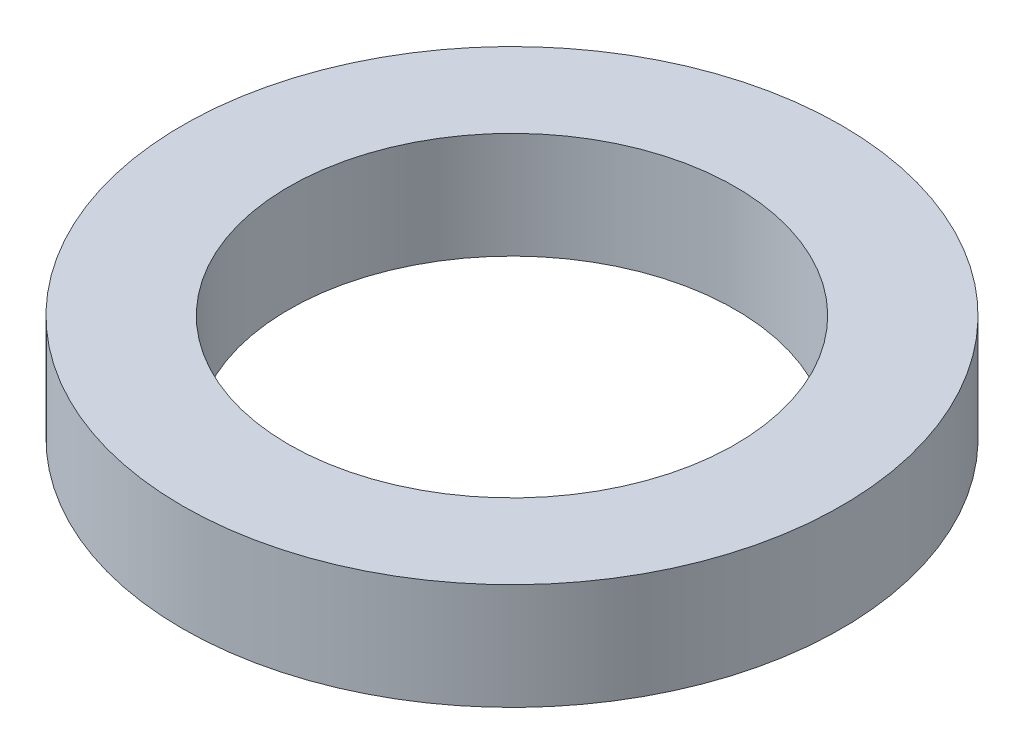
ISO-10303-21;
HEADER;
FILE_DESCRIPTION(('STEP AP214'),'2;1');
FILE_NAME('part.step','',(''),(''),'','','');
FILE_SCHEMA(('AUTOMOTIVE_DESIGN { 1 0 10303 214 1 1 1 1 }'));
ENDSEC;
DATA;
#1=APPLICATION_CONTEXT('core data for automotive mechanical design processes');
#2=APPLICATION_PROTOCOL_DEFINITION('international standard','automotive_design',2000,#1);
#3=PRODUCT_CONTEXT('',#1,'mechanical');
#4=PRODUCT('Part','Part','',(#3));
#5=PRODUCT_RELATED_PRODUCT_CATEGORY('part','',(#4));
#6=PRODUCT_DEFINITION_FORMATION('','',#4);
#7=PRODUCT_DEFINITION_CONTEXT('part definition',#1,'design');
#8=PRODUCT_DEFINITION('design','',#6,#7);
#9=PRODUCT_DEFINITION_SHAPE('','',#8);
#10=(LENGTH_UNIT() NAMED_UNIT(*) SI_UNIT(.MILLI.,.METRE.));
#11=(NAMED_UNIT(*) PLANE_ANGLE_UNIT() SI_UNIT($,.RADIAN.));
#12=(NAMED_UNIT(*) SI_UNIT($,.STERADIAN.) SOLID_ANGLE_UNIT());
#13=UNCERTAINTY_MEASURE_WITH_UNIT(LENGTH_MEASURE(1.E-05),#10,'distance_accuracy_value','');
#14=(GEOMETRIC_REPRESENTATION_CONTEXT(3) GLOBAL_UNCERTAINTY_ASSIGNED_CONTEXT((#13)) GLOBAL_UNIT_ASSIGNED_CONTEXT((#10,
#11,#12)) REPRESENTATION_CONTEXT('',''));
#15=CARTESIAN_POINT('',(0.,0.,0.));
#16=DIRECTION('',(0.,0.,1.));
#17=DIRECTION('',(1.,0.,0.));
#18=AXIS2_PLACEMENT_3D('',#15,#16,#17);
#19=CARTESIAN_POINT('',(0.,1.,0.));
#20=DIRECTION('',(0.,1.,0.));
#21=DIRECTION('',(0.,0.,1.));
#22=AXIS2_PLACEMENT_3D('',#19,#20,#21);
#23=PLANE('',#22);
#24=CARTESIAN_POINT('',(0.,1.,0.));
#25=DIRECTION('',(0.,1.,0.));
#26=DIRECTION('',(0.,0.,1.));
#27=AXIS2_PLACEMENT_3D('',#24,#25,#26);
#28=CIRCLE('',#27,3.1);
#29=CARTESIAN_POINT('',(0.,1.,3.1));
#30=VERTEX_POINT('',#29);
#31=EDGE_CURVE('E10',#30,#30,#28,.T.);
#32=ORIENTED_EDGE('',*,*,#31,.T.);
#33=EDGE_LOOP('',(#32));
#34=FACE_BOUND('',#33,.T.);
#35=CARTESIAN_POINT('',(0.,1.,0.));
#36=DIRECTION('',(0.,1.,0.));
#37=DIRECTION('',(0.,0.,1.));
#38=AXIS2_PLACEMENT_3D('',#35,#36,#37);
#39=CIRCLE('',#38,2.1);
#40=CARTESIAN_POINT('',(0.,1.,2.1));
#41=VERTEX_POINT('',#40);
#42=EDGE_CURVE('E46',#41,#41,#39,.T.);
#43=ORIENTED_EDGE('',*,*,#42,.F.);
#44=EDGE_LOOP('',(#43));
#45=FACE_BOUND('',#44,.T.);
#46=ADVANCED_FACE('F35',(#34,#45),#23,.T.);
#47=CARTESIAN_POINT('',(0.,0.,0.));
#48=DIRECTION('',(0.,1.,0.));
#49=DIRECTION('',(0.,0.,1.));
#50=AXIS2_PLACEMENT_3D('',#47,#48,#49);
#51=PLANE('',#50);
#52=CARTESIAN_POINT('',(0.,0.,0.));
#53=DIRECTION('',(0.,1.,0.));
#54=DIRECTION('',(0.,0.,1.));
#55=AXIS2_PLACEMENT_3D('',#52,#53,#54);
#56=CIRCLE('',#55,3.1);
#57=CARTESIAN_POINT('',(0.,0.,3.1));
#58=VERTEX_POINT('',#57);
#59=EDGE_CURVE('E39',#58,#58,#56,.T.);
#60=ORIENTED_EDGE('',*,*,#59,.F.);
#61=EDGE_LOOP('',(#60));
#62=FACE_BOUND('',#61,.T.);
#63=CARTESIAN_POINT('',(0.,0.,0.));
#64=DIRECTION('',(0.,1.,0.));
#65=DIRECTION('',(0.,0.,1.));
#66=AXIS2_PLACEMENT_3D('',#63,#64,#65);
#67=CIRCLE('',#66,2.1);
#68=CARTESIAN_POINT('',(0.,0.,2.1));
#69=VERTEX_POINT('',#68);
#70=EDGE_CURVE('E48',#69,#69,#67,.T.);
#71=ORIENTED_EDGE('',*,*,#70,.T.);
#72=EDGE_LOOP('',(#71));
#73=FACE_BOUND('',#72,.T.);
#74=ADVANCED_FACE('F58',(#62,#73),#51,.F.);
#75=CARTESIAN_POINT('',(0.,1.,0.));
#76=DIRECTION('',(0.,-1.,0.));
#77=DIRECTION('',(0.,0.,-1.));
#78=AXIS2_PLACEMENT_3D('',#75,#76,#77);
#79=CYLINDRICAL_SURFACE('',#78,3.1);
#80=ORIENTED_EDGE('',*,*,#31,.F.);
#81=EDGE_LOOP('',(#80));
#82=FACE_BOUND('',#81,.T.);
#83=ORIENTED_EDGE('',*,*,#59,.T.);
#84=EDGE_LOOP('',(#83));
#85=FACE_BOUND('',#84,.T.);
#86=ADVANCED_FACE('F37',(#82,#85),#79,.T.);
#87=CARTESIAN_POINT('',(0.,1.,0.));
#88=DIRECTION('',(0.,-1.,0.));
#89=DIRECTION('',(0.,0.,-1.));
#90=AXIS2_PLACEMENT_3D('',#87,#88,#89);
#91=CYLINDRICAL_SURFACE('',#90,2.1);
#92=ORIENTED_EDGE('',*,*,#42,.T.);
#93=EDGE_LOOP('',(#92));
#94=FACE_BOUND('',#93,.T.);
#95=ORIENTED_EDGE('',*,*,#70,.F.);
#96=EDGE_LOOP('',(#95));
#97=FACE_BOUND('',#96,.T.);
#98=ADVANCED_FACE('F54',(#94,#97),#91,.F.);
#99=CLOSED_SHELL('',(#46,#74,#86,#98));
#100=MANIFOLD_SOLID_BREP('B2',#99);
#101=ADVANCED_BREP_SHAPE_REPRESENTATION('',(#18,#100),#14);
#102=SHAPE_DEFINITION_REPRESENTATION(#9,#101);
ENDSEC;
END-ISO-10303-21;
